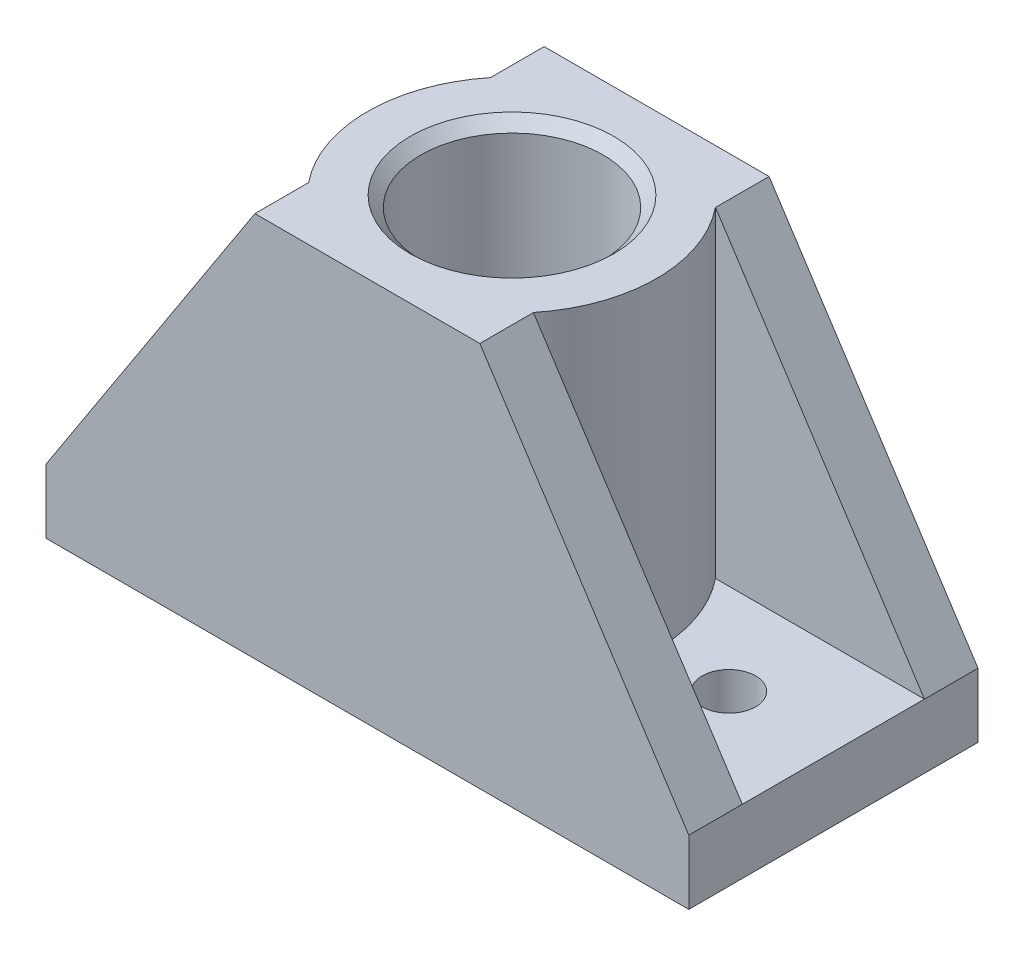
ISO-10303-21;
HEADER;
FILE_DESCRIPTION(('STEP AP214'),'2;1');
FILE_NAME('part.step','',(''),(''),'','','');
FILE_SCHEMA(('AUTOMOTIVE_DESIGN { 1 0 10303 214 1 1 1 1 }'));
ENDSEC;
DATA;
#1=APPLICATION_CONTEXT('core data for automotive mechanical design processes');
#2=APPLICATION_PROTOCOL_DEFINITION('international standard','automotive_design',2000,#1);
#3=PRODUCT_CONTEXT('',#1,'mechanical');
#4=PRODUCT('Part','Part','',(#3));
#5=PRODUCT_RELATED_PRODUCT_CATEGORY('part','',(#4));
#6=PRODUCT_DEFINITION_FORMATION('','',#4);
#7=PRODUCT_DEFINITION_CONTEXT('part definition',#1,'design');
#8=PRODUCT_DEFINITION('design','',#6,#7);
#9=PRODUCT_DEFINITION_SHAPE('','',#8);
#10=(LENGTH_UNIT() NAMED_UNIT(*) SI_UNIT(.MILLI.,.METRE.));
#11=(NAMED_UNIT(*) PLANE_ANGLE_UNIT() SI_UNIT($,.RADIAN.));
#12=(NAMED_UNIT(*) SI_UNIT($,.STERADIAN.) SOLID_ANGLE_UNIT());
#13=UNCERTAINTY_MEASURE_WITH_UNIT(LENGTH_MEASURE(1.E-05),#10,'distance_accuracy_value','');
#14=(GEOMETRIC_REPRESENTATION_CONTEXT(3) GLOBAL_UNCERTAINTY_ASSIGNED_CONTEXT((#13)) GLOBAL_UNIT_ASSIGNED_CONTEXT((#10,
#11,#12)) REPRESENTATION_CONTEXT('',''));
#15=CARTESIAN_POINT('',(0.,0.,0.));
#16=DIRECTION('',(0.,0.,1.));
#17=DIRECTION('',(1.,0.,0.));
#18=AXIS2_PLACEMENT_3D('',#15,#16,#17);
#19=CARTESIAN_POINT('',(0.,6.,0.));
#20=DIRECTION('',(0.,1.,0.));
#21=DIRECTION('',(0.,0.,1.));
#22=AXIS2_PLACEMENT_3D('',#19,#20,#21);
#23=PLANE('',#22);
#24=CARTESIAN_POINT('',(-55.7962783397944,6.,-2.72177419354838));
#25=DIRECTION('',(0.,1.,0.));
#26=DIRECTION('',(0.,0.,1.));
#27=AXIS2_PLACEMENT_3D('',#24,#25,#26);
#28=CIRCLE('',#27,2.5);
#29=CARTESIAN_POINT('',(-55.7962783397944,6.,-0.221774193548373));
#30=VERTEX_POINT('',#29);
#31=EDGE_CURVE('E366',#30,#30,#28,.T.);
#32=ORIENTED_EDGE('',*,*,#31,.F.);
#33=EDGE_LOOP('',(#32));
#34=FACE_BOUND('',#33,.T.);
#35=CARTESIAN_POINT('',(-76.0403225806452,6.,-2.72177419354838));
#36=DIRECTION('',(0.,1.,0.));
#37=DIRECTION('',(0.,0.,1.));
#38=AXIS2_PLACEMENT_3D('',#35,#36,#37);
#39=CIRCLE('',#38,13.5);
#40=CARTESIAN_POINT('',(-65.5522340989436,6.,5.77822580645163));
#41=VERTEX_POINT('',#40);
#42=CARTESIAN_POINT('',(-65.5522340989436,6.,-11.2217741935484));
#43=VERTEX_POINT('',#42);
#44=EDGE_CURVE('E167',#41,#43,#39,.T.);
#45=ORIENTED_EDGE('',*,*,#44,.F.);
#46=DIRECTION('',(-1.,0.,0.));
#47=VECTOR('',#46,1.);
#48=CARTESIAN_POINT('',(-46.0403225806452,6.,5.77822580645162));
#49=LINE('',#48,#47);
#50=CARTESIAN_POINT('',(-46.0403225806452,6.,5.77822580645162));
#51=VERTEX_POINT('',#50);
#52=EDGE_CURVE('E143',#51,#41,#49,.T.);
#53=ORIENTED_EDGE('',*,*,#52,.F.);
#54=DIRECTION('',(0.,0.,-1.));
#55=VECTOR('',#54,1.);
#56=CARTESIAN_POINT('',(-46.0403225806452,6.,-16.2217741935484));
#57=LINE('',#56,#55);
#58=CARTESIAN_POINT('',(-46.0403225806452,6.,-11.2217741935484));
#59=VERTEX_POINT('',#58);
#60=EDGE_CURVE('E154',#51,#59,#57,.T.);
#61=ORIENTED_EDGE('',*,*,#60,.T.);
#62=DIRECTION('',(1.,0.,0.));
#63=VECTOR('',#62,1.);
#64=CARTESIAN_POINT('',(-106.040322580645,6.,-11.2217741935484));
#65=LINE('',#64,#63);
#66=EDGE_CURVE('E300',#43,#59,#65,.T.);
#67=ORIENTED_EDGE('',*,*,#66,.F.);
#68=EDGE_LOOP('',(#45,#53,#61,#67));
#69=FACE_BOUND('',#68,.T.);
#70=ADVANCED_FACE('F36',(#34,#69),#23,.T.);
#71=CARTESIAN_POINT('',(-96.2843668214959,6.,-2.72177419354837));
#72=DIRECTION('',(0.,1.,0.));
#73=DIRECTION('',(0.,0.,1.));
#74=AXIS2_PLACEMENT_3D('',#71,#72,#73);
#75=CIRCLE('',#74,2.50000000000001);
#76=CARTESIAN_POINT('',(-96.2843668214959,6.,-0.221774193548361));
#77=VERTEX_POINT('',#76);
#78=EDGE_CURVE('E196',#77,#77,#75,.T.);
#79=ORIENTED_EDGE('',*,*,#78,.F.);
#80=EDGE_LOOP('',(#79));
#81=FACE_BOUND('',#80,.T.);
#82=DIRECTION('',(0.,0.,1.));
#83=VECTOR('',#82,1.);
#84=CARTESIAN_POINT('',(-106.040322580645,6.,-16.2217741935484));
#85=LINE('',#84,#83);
#86=CARTESIAN_POINT('',(-106.040322580645,6.,-11.2217741935484));
#87=VERTEX_POINT('',#86);
#88=CARTESIAN_POINT('',(-106.040322580645,6.,5.77822580645163));
#89=VERTEX_POINT('',#88);
#90=EDGE_CURVE('E164',#87,#89,#85,.T.);
#91=ORIENTED_EDGE('',*,*,#90,.T.);
#92=CARTESIAN_POINT('',(-86.5284110623466,6.,5.77822580645163));
#93=VERTEX_POINT('',#92);
#94=EDGE_CURVE('E169',#93,#89,#49,.T.);
#95=ORIENTED_EDGE('',*,*,#94,.F.);
#96=CARTESIAN_POINT('',(-86.5284110623467,6.,-11.2217741935484));
#97=VERTEX_POINT('',#96);
#98=EDGE_CURVE('E246',#97,#93,#39,.T.);
#99=ORIENTED_EDGE('',*,*,#98,.F.);
#100=EDGE_CURVE('E307',#87,#97,#65,.T.);
#101=ORIENTED_EDGE('',*,*,#100,.F.);
#102=EDGE_LOOP('',(#91,#95,#99,#101));
#103=FACE_BOUND('',#102,.T.);
#104=ADVANCED_FACE('F215',(#81,#103),#23,.T.);
#105=CARTESIAN_POINT('',(-76.0403225806452,36.,-2.72177419354838));
#106=DIRECTION('',(0.,-1.,0.));
#107=DIRECTION('',(0.,0.,-1.));
#108=AXIS2_PLACEMENT_3D('',#105,#106,#107);
#109=CYLINDRICAL_SURFACE('',#108,13.5);
#110=DIRECTION('',(0.,-1.,0.));
#111=VECTOR('',#110,1.);
#112=CARTESIAN_POINT('',(-86.5284110623466,36.,5.77822580645163));
#113=LINE('',#112,#111);
#114=CARTESIAN_POINT('',(-86.5284110623466,36.,5.77822580645163));
#115=VERTEX_POINT('',#114);
#116=EDGE_CURVE('E293',#115,#93,#113,.T.);
#117=ORIENTED_EDGE('',*,*,#116,.F.);
#118=CARTESIAN_POINT('',(-76.0403225806452,36.,-2.72177419354838));
#119=DIRECTION('',(0.,1.,0.));
#120=DIRECTION('',(0.,0.,1.));
#121=AXIS2_PLACEMENT_3D('',#118,#119,#120);
#122=CIRCLE('',#121,13.5);
#123=CARTESIAN_POINT('',(-86.5284110623467,36.,-11.2217741935484));
#124=VERTEX_POINT('',#123);
#125=EDGE_CURVE('E252',#124,#115,#122,.T.);
#126=ORIENTED_EDGE('',*,*,#125,.F.);
#127=DIRECTION('',(0.,-1.,0.));
#128=VECTOR('',#127,1.);
#129=CARTESIAN_POINT('',(-86.5284110623467,36.,-11.2217741935484));
#130=LINE('',#129,#128);
#131=EDGE_CURVE('E248',#97,#124,#130,.F.);
#132=ORIENTED_EDGE('',*,*,#131,.F.);
#133=ORIENTED_EDGE('',*,*,#98,.T.);
#134=EDGE_LOOP('',(#117,#126,#132,#133));
#135=FACE_BOUND('',#134,.T.);
#136=ADVANCED_FACE('F222',(#135),#109,.T.);
#137=DIRECTION('',(0.,-1.,0.));
#138=VECTOR('',#137,1.);
#139=CARTESIAN_POINT('',(-65.5522340989436,36.,5.77822580645163));
#140=LINE('',#139,#138);
#141=CARTESIAN_POINT('',(-65.5522340989436,36.,5.77822580645163));
#142=VERTEX_POINT('',#141);
#143=EDGE_CURVE('E291',#41,#142,#140,.F.);
#144=ORIENTED_EDGE('',*,*,#143,.F.);
#145=ORIENTED_EDGE('',*,*,#44,.T.);
#146=DIRECTION('',(0.,-1.,0.));
#147=VECTOR('',#146,1.);
#148=CARTESIAN_POINT('',(-65.5522340989436,36.,-11.2217741935484));
#149=LINE('',#148,#147);
#150=CARTESIAN_POINT('',(-65.5522340989436,36.,-11.2217741935484));
#151=VERTEX_POINT('',#150);
#152=EDGE_CURVE('E242',#151,#43,#149,.T.);
#153=ORIENTED_EDGE('',*,*,#152,.F.);
#154=EDGE_CURVE('E244',#142,#151,#122,.T.);
#155=ORIENTED_EDGE('',*,*,#154,.F.);
#156=EDGE_LOOP('',(#144,#145,#153,#155));
#157=FACE_BOUND('',#156,.T.);
#158=ADVANCED_FACE('F344',(#157),#109,.T.);
#159=CARTESIAN_POINT('',(-106.040322580645,6.,-16.2217741935484));
#160=DIRECTION('',(1.,0.,0.));
#161=DIRECTION('',(0.,0.,-1.));
#162=AXIS2_PLACEMENT_3D('',#159,#160,#161);
#163=PLANE('',#162);
#164=DIRECTION('',(0.,-1.,0.));
#165=VECTOR('',#164,1.);
#166=CARTESIAN_POINT('',(-106.040322580645,6.,10.7782258064516));
#167=LINE('',#166,#165);
#168=CARTESIAN_POINT('',(-106.040322580645,5.9999999999998,10.7782258064516));
#169=VERTEX_POINT('',#168);
#170=CARTESIAN_POINT('',(-106.040322580645,0.,10.7782258064516));
#171=VERTEX_POINT('',#170);
#172=EDGE_CURVE('E274',#169,#171,#167,.T.);
#173=ORIENTED_EDGE('',*,*,#172,.F.);
#174=DIRECTION('',(0.,0.,-1.));
#175=VECTOR('',#174,1.);
#176=CARTESIAN_POINT('',(-106.040322580645,5.9999999999998,5.77822580645163));
#177=LINE('',#176,#175);
#178=EDGE_CURVE('E186',#169,#89,#177,.T.);
#179=ORIENTED_EDGE('',*,*,#178,.T.);
#180=ORIENTED_EDGE('',*,*,#90,.F.);
#181=DIRECTION('',(0.,0.,-1.));
#182=VECTOR('',#181,1.);
#183=CARTESIAN_POINT('',(-106.040322580645,5.9999999999998,-16.2217741935484));
#184=LINE('',#183,#182);
#185=CARTESIAN_POINT('',(-106.040322580645,5.9999999999998,-16.2217741935484));
#186=VERTEX_POINT('',#185);
#187=EDGE_CURVE('E51',#87,#186,#184,.T.);
#188=ORIENTED_EDGE('',*,*,#187,.T.);
#189=DIRECTION('',(0.,-1.,0.));
#190=VECTOR('',#189,1.);
#191=CARTESIAN_POINT('',(-106.040322580645,6.,-16.2217741935484));
#192=LINE('',#191,#190);
#193=CARTESIAN_POINT('',(-106.040322580645,0.,-16.2217741935484));
#194=VERTEX_POINT('',#193);
#195=EDGE_CURVE('E163',#186,#194,#192,.T.);
#196=ORIENTED_EDGE('',*,*,#195,.T.);
#197=DIRECTION('',(0.,0.,1.));
#198=VECTOR('',#197,1.);
#199=CARTESIAN_POINT('',(-106.040322580645,0.,-16.2217741935484));
#200=LINE('',#199,#198);
#201=EDGE_CURVE('E254',#194,#171,#200,.T.);
#202=ORIENTED_EDGE('',*,*,#201,.T.);
#203=EDGE_LOOP('',(#173,#179,#180,#188,#196,#202));
#204=FACE_BOUND('',#203,.T.);
#205=ADVANCED_FACE('F325',(#204),#163,.F.);
#206=CARTESIAN_POINT('',(-106.040322580645,6.,10.7782258064516));
#207=DIRECTION('',(0.,0.,-1.));
#208=DIRECTION('',(-1.,0.,0.));
#209=AXIS2_PLACEMENT_3D('',#206,#207,#208);
#210=PLANE('',#209);
#211=DIRECTION('',(0.,-1.,0.));
#212=VECTOR('',#211,1.);
#213=CARTESIAN_POINT('',(-46.0403225806452,6.,10.7782258064516));
#214=LINE('',#213,#212);
#215=CARTESIAN_POINT('',(-46.0403225806452,5.99999999999983,10.7782258064516));
#216=VERTEX_POINT('',#215);
#217=CARTESIAN_POINT('',(-46.0403225806452,0.,10.7782258064516));
#218=VERTEX_POINT('',#217);
#219=EDGE_CURVE('E272',#216,#218,#214,.T.);
#220=ORIENTED_EDGE('',*,*,#219,.F.);
#221=DIRECTION('',(-0.544988350595413,0.838443616300638,0.));
#222=VECTOR('',#221,1.);
#223=CARTESIAN_POINT('',(-65.5403225806452,36.,10.7782258064516));
#224=LINE('',#223,#222);
#225=CARTESIAN_POINT('',(-65.5403225806452,36.,10.7782258064516));
#226=VERTEX_POINT('',#225);
#227=EDGE_CURVE('E173',#216,#226,#224,.T.);
#228=ORIENTED_EDGE('',*,*,#227,.T.);
#229=DIRECTION('',(1.,0.,0.));
#230=VECTOR('',#229,1.);
#231=CARTESIAN_POINT('',(-46.0403225806452,36.,10.7782258064516));
#232=LINE('',#231,#230);
#233=CARTESIAN_POINT('',(-86.5403225806451,36.,10.7782258064516));
#234=VERTEX_POINT('',#233);
#235=EDGE_CURVE('E288',#234,#226,#232,.T.);
#236=ORIENTED_EDGE('',*,*,#235,.F.);
#237=DIRECTION('',(-0.544988350595413,-0.838443616300638,0.));
#238=VECTOR('',#237,1.);
#239=CARTESIAN_POINT('',(-86.5403225806451,36.,10.7782258064516));
#240=LINE('',#239,#238);
#241=EDGE_CURVE('E59',#234,#169,#240,.T.);
#242=ORIENTED_EDGE('',*,*,#241,.T.);
#243=ORIENTED_EDGE('',*,*,#172,.T.);
#244=DIRECTION('',(1.,0.,0.));
#245=VECTOR('',#244,1.);
#246=CARTESIAN_POINT('',(-106.040322580645,0.,10.7782258064516));
#247=LINE('',#246,#245);
#248=EDGE_CURVE('E261',#171,#218,#247,.T.);
#249=ORIENTED_EDGE('',*,*,#248,.T.);
#250=EDGE_LOOP('',(#220,#228,#236,#242,#243,#249));
#251=FACE_BOUND('',#250,.T.);
#252=ADVANCED_FACE('F329',(#251),#210,.F.);
#253=CARTESIAN_POINT('',(-46.0403225806452,6.,-16.2217741935484));
#254=DIRECTION('',(-1.,0.,0.));
#255=DIRECTION('',(0.,0.,1.));
#256=AXIS2_PLACEMENT_3D('',#253,#254,#255);
#257=PLANE('',#256);
#258=ORIENTED_EDGE('',*,*,#60,.F.);
#259=DIRECTION('',(0.,0.,1.));
#260=VECTOR('',#259,1.);
#261=CARTESIAN_POINT('',(-46.0403225806452,5.99999999999983,10.7782258064516));
#262=LINE('',#261,#260);
#263=EDGE_CURVE('E156',#51,#216,#262,.T.);
#264=ORIENTED_EDGE('',*,*,#263,.T.);
#265=ORIENTED_EDGE('',*,*,#219,.T.);
#266=DIRECTION('',(0.,0.,-1.));
#267=VECTOR('',#266,1.);
#268=CARTESIAN_POINT('',(-46.0403225806452,0.,-16.2217741935484));
#269=LINE('',#268,#267);
#270=CARTESIAN_POINT('',(-46.0403225806452,0.,-16.2217741935484));
#271=VERTEX_POINT('',#270);
#272=EDGE_CURVE('E264',#218,#271,#269,.T.);
#273=ORIENTED_EDGE('',*,*,#272,.T.);
#274=DIRECTION('',(0.,-1.,0.));
#275=VECTOR('',#274,1.);
#276=CARTESIAN_POINT('',(-46.0403225806452,6.,-16.2217741935484));
#277=LINE('',#276,#275);
#278=CARTESIAN_POINT('',(-46.0403225806452,5.99999999999983,-16.2217741935484));
#279=VERTEX_POINT('',#278);
#280=EDGE_CURVE('E270',#279,#271,#277,.T.);
#281=ORIENTED_EDGE('',*,*,#280,.F.);
#282=DIRECTION('',(0.,0.,1.));
#283=VECTOR('',#282,1.);
#284=CARTESIAN_POINT('',(-46.0403225806452,5.99999999999983,-11.2217741935484));
#285=LINE('',#284,#283);
#286=EDGE_CURVE('E149',#279,#59,#285,.T.);
#287=ORIENTED_EDGE('',*,*,#286,.T.);
#288=EDGE_LOOP('',(#258,#264,#265,#273,#281,#287));
#289=FACE_BOUND('',#288,.T.);
#290=ADVANCED_FACE('F155',(#289),#257,.F.);
#291=CARTESIAN_POINT('',(-106.040322580645,6.,-16.2217741935484));
#292=DIRECTION('',(0.,0.,1.));
#293=DIRECTION('',(1.,0.,0.));
#294=AXIS2_PLACEMENT_3D('',#291,#292,#293);
#295=PLANE('',#294);
#296=DIRECTION('',(-1.,0.,0.));
#297=VECTOR('',#296,1.);
#298=CARTESIAN_POINT('',(-106.040322580645,36.,-16.2217741935484));
#299=LINE('',#298,#297);
#300=CARTESIAN_POINT('',(-65.5403225806452,36.,-16.2217741935484));
#301=VERTEX_POINT('',#300);
#302=CARTESIAN_POINT('',(-86.5403225806451,36.,-16.2217741935484));
#303=VERTEX_POINT('',#302);
#304=EDGE_CURVE('E303',#301,#303,#299,.T.);
#305=ORIENTED_EDGE('',*,*,#304,.F.);
#306=DIRECTION('',(0.544988350595413,-0.838443616300638,0.));
#307=VECTOR('',#306,1.);
#308=CARTESIAN_POINT('',(-65.5403225806452,36.,-16.2217741935484));
#309=LINE('',#308,#307);
#310=EDGE_CURVE('E181',#301,#279,#309,.T.);
#311=ORIENTED_EDGE('',*,*,#310,.T.);
#312=ORIENTED_EDGE('',*,*,#280,.T.);
#313=DIRECTION('',(-1.,0.,0.));
#314=VECTOR('',#313,1.);
#315=CARTESIAN_POINT('',(-106.040322580645,0.,-16.2217741935484));
#316=LINE('',#315,#314);
#317=EDGE_CURVE('E257',#271,#194,#316,.T.);
#318=ORIENTED_EDGE('',*,*,#317,.T.);
#319=ORIENTED_EDGE('',*,*,#195,.F.);
#320=DIRECTION('',(0.544988350595413,0.838443616300638,0.));
#321=VECTOR('',#320,1.);
#322=CARTESIAN_POINT('',(-86.5403225806451,36.,-16.2217741935484));
#323=LINE('',#322,#321);
#324=EDGE_CURVE('E179',#186,#303,#323,.T.);
#325=ORIENTED_EDGE('',*,*,#324,.T.);
#326=EDGE_LOOP('',(#305,#311,#312,#318,#319,#325));
#327=FACE_BOUND('',#326,.T.);
#328=ADVANCED_FACE('F370',(#327),#295,.F.);
#329=CARTESIAN_POINT('',(0.,0.,0.));
#330=DIRECTION('',(0.,1.,0.));
#331=DIRECTION('',(0.,0.,1.));
#332=AXIS2_PLACEMENT_3D('',#329,#330,#331);
#333=PLANE('',#332);
#334=CARTESIAN_POINT('',(-96.2843668214959,0.,-2.72177419354837));
#335=DIRECTION('',(0.,1.,0.));
#336=DIRECTION('',(0.,0.,1.));
#337=AXIS2_PLACEMENT_3D('',#334,#335,#336);
#338=CIRCLE('',#337,2.50000000000001);
#339=CARTESIAN_POINT('',(-96.2843668214959,0.,-0.221774193548361));
#340=VERTEX_POINT('',#339);
#341=EDGE_CURVE('E195',#340,#340,#338,.T.);
#342=ORIENTED_EDGE('',*,*,#341,.T.);
#343=EDGE_LOOP('',(#342));
#344=FACE_BOUND('',#343,.T.);
#345=CARTESIAN_POINT('',(-55.7962783397944,0.,-2.72177419354838));
#346=DIRECTION('',(0.,1.,0.));
#347=DIRECTION('',(0.,0.,1.));
#348=AXIS2_PLACEMENT_3D('',#345,#346,#347);
#349=CIRCLE('',#348,2.5);
#350=CARTESIAN_POINT('',(-55.7962783397944,0.,-0.221774193548373));
#351=VERTEX_POINT('',#350);
#352=EDGE_CURVE('E192',#351,#351,#349,.T.);
#353=ORIENTED_EDGE('',*,*,#352,.T.);
#354=EDGE_LOOP('',(#353));
#355=FACE_BOUND('',#354,.T.);
#356=ORIENTED_EDGE('',*,*,#201,.F.);
#357=ORIENTED_EDGE('',*,*,#317,.F.);
#358=ORIENTED_EDGE('',*,*,#272,.F.);
#359=ORIENTED_EDGE('',*,*,#248,.F.);
#360=EDGE_LOOP('',(#356,#357,#358,#359));
#361=FACE_BOUND('',#360,.T.);
#362=ADVANCED_FACE('F332',(#344,#355,#361),#333,.F.);
#363=CARTESIAN_POINT('',(-76.0403225806452,36.,-2.72177419354838));
#364=DIRECTION('',(0.,1.,0.));
#365=DIRECTION('',(0.,0.,1.));
#366=AXIS2_PLACEMENT_3D('',#363,#364,#365);
#367=PLANE('',#366);
#368=CARTESIAN_POINT('',(-76.0403225806452,36.,-2.72177419354838));
#369=DIRECTION('',(0.,1.,0.));
#370=DIRECTION('',(0.,0.,1.));
#371=AXIS2_PLACEMENT_3D('',#368,#369,#370);
#372=CIRCLE('',#371,9.49999999999999);
#373=CARTESIAN_POINT('',(-76.0403225806452,36.,6.77822580645161));
#374=VERTEX_POINT('',#373);
#375=EDGE_CURVE('E11',#374,#374,#372,.F.);
#376=ORIENTED_EDGE('',*,*,#375,.T.);
#377=EDGE_LOOP('',(#376));
#378=FACE_BOUND('',#377,.T.);
#379=ORIENTED_EDGE('',*,*,#235,.T.);
#380=DIRECTION('',(0.,0.,-1.));
#381=VECTOR('',#380,1.);
#382=CARTESIAN_POINT('',(-65.5403225806452,36.,5.77822580645162));
#383=LINE('',#382,#381);
#384=CARTESIAN_POINT('',(-65.5403225806452,36.,5.77822580645163));
#385=VERTEX_POINT('',#384);
#386=EDGE_CURVE('E150',#226,#385,#383,.T.);
#387=ORIENTED_EDGE('',*,*,#386,.T.);
#388=DIRECTION('',(-1.,0.,0.));
#389=VECTOR('',#388,1.);
#390=CARTESIAN_POINT('',(-46.0403225806452,36.,5.77822580645162));
#391=LINE('',#390,#389);
#392=EDGE_CURVE('E144',#385,#142,#391,.T.);
#393=ORIENTED_EDGE('',*,*,#392,.T.);
#394=ORIENTED_EDGE('',*,*,#154,.T.);
#395=DIRECTION('',(1.,0.,0.));
#396=VECTOR('',#395,1.);
#397=CARTESIAN_POINT('',(-106.040322580645,36.,-11.2217741935484));
#398=LINE('',#397,#396);
#399=CARTESIAN_POINT('',(-65.5403225806452,36.,-11.2217741935484));
#400=VERTEX_POINT('',#399);
#401=EDGE_CURVE('E304',#151,#400,#398,.T.);
#402=ORIENTED_EDGE('',*,*,#401,.T.);
#403=DIRECTION('',(0.,0.,-1.));
#404=VECTOR('',#403,1.);
#405=CARTESIAN_POINT('',(-65.5403225806452,36.,-16.2217741935484));
#406=LINE('',#405,#404);
#407=EDGE_CURVE('E282',#400,#301,#406,.T.);
#408=ORIENTED_EDGE('',*,*,#407,.T.);
#409=ORIENTED_EDGE('',*,*,#304,.T.);
#410=DIRECTION('',(0.,0.,1.));
#411=VECTOR('',#410,1.);
#412=CARTESIAN_POINT('',(-86.5403225806451,36.,-11.2217741935484));
#413=LINE('',#412,#411);
#414=CARTESIAN_POINT('',(-86.5403225806451,36.,-11.2217741935484));
#415=VERTEX_POINT('',#414);
#416=EDGE_CURVE('E276',#303,#415,#413,.T.);
#417=ORIENTED_EDGE('',*,*,#416,.T.);
#418=EDGE_CURVE('E301',#415,#124,#398,.T.);
#419=ORIENTED_EDGE('',*,*,#418,.T.);
#420=ORIENTED_EDGE('',*,*,#125,.T.);
#421=CARTESIAN_POINT('',(-86.5403225806451,36.,5.77822580645163));
#422=VERTEX_POINT('',#421);
#423=EDGE_CURVE('E168',#115,#422,#391,.T.);
#424=ORIENTED_EDGE('',*,*,#423,.T.);
#425=DIRECTION('',(0.,0.,1.));
#426=VECTOR('',#425,1.);
#427=CARTESIAN_POINT('',(-86.5403225806451,36.,10.7782258064516));
#428=LINE('',#427,#426);
#429=EDGE_CURVE('E279',#422,#234,#428,.T.);
#430=ORIENTED_EDGE('',*,*,#429,.T.);
#431=EDGE_LOOP('',(#379,#387,#393,#394,#402,#408,#409,#417,#419,#420,#424,#430));
#432=FACE_BOUND('',#431,.T.);
#433=ADVANCED_FACE('F237',(#378,#432),#367,.T.);
#434=CARTESIAN_POINT('',(-76.0403225806452,36.,-2.72177419354838));
#435=DIRECTION('',(0.,-1.,0.));
#436=DIRECTION('',(0.,0.,-1.));
#437=AXIS2_PLACEMENT_3D('',#434,#435,#436);
#438=CYLINDRICAL_SURFACE('',#437,8.5);
#439=CARTESIAN_POINT('',(-76.0403225806452,35.,-2.72177419354838));
#440=DIRECTION('',(0.,1.,0.));
#441=DIRECTION('',(0.,0.,1.));
#442=AXIS2_PLACEMENT_3D('',#439,#440,#441);
#443=CIRCLE('',#442,8.5);
#444=CARTESIAN_POINT('',(-76.0403225806452,35.,5.77822580645162));
#445=VERTEX_POINT('',#444);
#446=EDGE_CURVE('E44',#445,#445,#443,.T.);
#447=ORIENTED_EDGE('',*,*,#446,.T.);
#448=EDGE_LOOP('',(#447));
#449=FACE_BOUND('',#448,.T.);
#450=CARTESIAN_POINT('',(-76.0403225806452,6.,-2.72177419354838));
#451=DIRECTION('',(0.,1.,0.));
#452=DIRECTION('',(0.,0.,1.));
#453=AXIS2_PLACEMENT_3D('',#450,#451,#452);
#454=CIRCLE('',#453,8.5);
#455=CARTESIAN_POINT('',(-76.0403225806452,6.,5.77822580645162));
#456=VERTEX_POINT('',#455);
#457=EDGE_CURVE('E241',#456,#456,#454,.T.);
#458=ORIENTED_EDGE('',*,*,#457,.F.);
#459=EDGE_LOOP('',(#458));
#460=FACE_BOUND('',#459,.T.);
#461=ADVANCED_FACE('F201',(#449,#460),#438,.F.);
#462=ORIENTED_EDGE('',*,*,#457,.T.);
#463=EDGE_LOOP('',(#462));
#464=FACE_BOUND('',#463,.T.);
#465=ADVANCED_FACE('F218',(#464),#23,.T.);
#466=CARTESIAN_POINT('',(-106.040322580645,36.,-11.2217741935484));
#467=DIRECTION('',(0.,0.,-1.));
#468=DIRECTION('',(-1.,0.,0.));
#469=AXIS2_PLACEMENT_3D('',#466,#467,#468);
#470=PLANE('',#469);
#471=ORIENTED_EDGE('',*,*,#66,.T.);
#472=DIRECTION('',(-0.544988350595413,0.838443616300638,0.));
#473=VECTOR('',#472,1.);
#474=CARTESIAN_POINT('',(-65.5403225806452,36.,-11.2217741935484));
#475=LINE('',#474,#473);
#476=EDGE_CURVE('E183',#59,#400,#475,.T.);
#477=ORIENTED_EDGE('',*,*,#476,.T.);
#478=ORIENTED_EDGE('',*,*,#401,.F.);
#479=ORIENTED_EDGE('',*,*,#152,.T.);
#480=EDGE_LOOP('',(#471,#477,#478,#479));
#481=FACE_BOUND('',#480,.T.);
#482=ADVANCED_FACE('F228',(#481),#470,.F.);
#483=ORIENTED_EDGE('',*,*,#418,.F.);
#484=DIRECTION('',(-0.544988350595413,-0.838443616300638,0.));
#485=VECTOR('',#484,1.);
#486=CARTESIAN_POINT('',(-86.5403225806451,36.,-11.2217741935484));
#487=LINE('',#486,#485);
#488=EDGE_CURVE('E190',#415,#87,#487,.T.);
#489=ORIENTED_EDGE('',*,*,#488,.T.);
#490=ORIENTED_EDGE('',*,*,#100,.T.);
#491=ORIENTED_EDGE('',*,*,#131,.T.);
#492=EDGE_LOOP('',(#483,#489,#490,#491));
#493=FACE_BOUND('',#492,.T.);
#494=ADVANCED_FACE('F234',(#493),#470,.F.);
#495=CARTESIAN_POINT('',(-46.0403225806452,36.,5.77822580645162));
#496=DIRECTION('',(0.,0.,1.));
#497=DIRECTION('',(1.,0.,0.));
#498=AXIS2_PLACEMENT_3D('',#495,#496,#497);
#499=PLANE('',#498);
#500=ORIENTED_EDGE('',*,*,#94,.T.);
#501=DIRECTION('',(0.544988350595413,0.838443616300638,0.));
#502=VECTOR('',#501,1.);
#503=CARTESIAN_POINT('',(-86.5403225806451,36.,5.77822580645163));
#504=LINE('',#503,#502);
#505=EDGE_CURVE('E188',#89,#422,#504,.T.);
#506=ORIENTED_EDGE('',*,*,#505,.T.);
#507=ORIENTED_EDGE('',*,*,#423,.F.);
#508=ORIENTED_EDGE('',*,*,#116,.T.);
#509=EDGE_LOOP('',(#500,#506,#507,#508));
#510=FACE_BOUND('',#509,.T.);
#511=ADVANCED_FACE('F320',(#510),#499,.F.);
#512=ORIENTED_EDGE('',*,*,#392,.F.);
#513=DIRECTION('',(0.544988350595413,-0.838443616300638,0.));
#514=VECTOR('',#513,1.);
#515=CARTESIAN_POINT('',(-65.5403225806452,36.,5.77822580645163));
#516=LINE('',#515,#514);
#517=EDGE_CURVE('E138',#385,#51,#516,.T.);
#518=ORIENTED_EDGE('',*,*,#517,.T.);
#519=ORIENTED_EDGE('',*,*,#52,.T.);
#520=ORIENTED_EDGE('',*,*,#143,.T.);
#521=EDGE_LOOP('',(#512,#518,#519,#520));
#522=FACE_BOUND('',#521,.T.);
#523=ADVANCED_FACE('F140',(#522),#499,.F.);
#524=CARTESIAN_POINT('',(-65.5403225806452,36.,-2.72177419354838));
#525=DIRECTION('',(0.838443616300638,0.544988350595413,0.));
#526=DIRECTION('',(0.,0.,1.));
#527=AXIS2_PLACEMENT_3D('',#524,#525,#526);
#528=PLANE('',#527);
#529=ORIENTED_EDGE('',*,*,#227,.F.);
#530=ORIENTED_EDGE('',*,*,#263,.F.);
#531=ORIENTED_EDGE('',*,*,#517,.F.);
#532=ORIENTED_EDGE('',*,*,#386,.F.);
#533=EDGE_LOOP('',(#529,#530,#531,#532));
#534=FACE_BOUND('',#533,.T.);
#535=ADVANCED_FACE('F172',(#534),#528,.T.);
#536=CARTESIAN_POINT('',(-65.5403225806452,36.,-2.72177419354838));
#537=DIRECTION('',(0.838443616300638,0.544988350595413,0.));
#538=DIRECTION('',(0.,0.,1.));
#539=AXIS2_PLACEMENT_3D('',#536,#537,#538);
#540=PLANE('',#539);
#541=ORIENTED_EDGE('',*,*,#476,.F.);
#542=ORIENTED_EDGE('',*,*,#286,.F.);
#543=ORIENTED_EDGE('',*,*,#310,.F.);
#544=ORIENTED_EDGE('',*,*,#407,.F.);
#545=EDGE_LOOP('',(#541,#542,#543,#544));
#546=FACE_BOUND('',#545,.T.);
#547=ADVANCED_FACE('F337',(#546),#540,.T.);
#548=CARTESIAN_POINT('',(-86.5403225806451,36.,-2.72177419354838));
#549=DIRECTION('',(-0.838443616300638,0.544988350595413,0.));
#550=DIRECTION('',(0.,0.,-1.));
#551=AXIS2_PLACEMENT_3D('',#548,#549,#550);
#552=PLANE('',#551);
#553=ORIENTED_EDGE('',*,*,#505,.F.);
#554=ORIENTED_EDGE('',*,*,#178,.F.);
#555=ORIENTED_EDGE('',*,*,#241,.F.);
#556=ORIENTED_EDGE('',*,*,#429,.F.);
#557=EDGE_LOOP('',(#553,#554,#555,#556));
#558=FACE_BOUND('',#557,.T.);
#559=ADVANCED_FACE('F324',(#558),#552,.T.);
#560=CARTESIAN_POINT('',(-86.5403225806451,36.,-2.72177419354838));
#561=DIRECTION('',(-0.838443616300638,0.544988350595413,0.));
#562=DIRECTION('',(0.,0.,-1.));
#563=AXIS2_PLACEMENT_3D('',#560,#561,#562);
#564=PLANE('',#563);
#565=ORIENTED_EDGE('',*,*,#324,.F.);
#566=ORIENTED_EDGE('',*,*,#187,.F.);
#567=ORIENTED_EDGE('',*,*,#488,.F.);
#568=ORIENTED_EDGE('',*,*,#416,.F.);
#569=EDGE_LOOP('',(#565,#566,#567,#568));
#570=FACE_BOUND('',#569,.T.);
#571=ADVANCED_FACE('F358',(#570),#564,.T.);
#572=CARTESIAN_POINT('',(-55.7962783397944,-24.,-2.72177419354838));
#573=DIRECTION('',(0.,1.,0.));
#574=DIRECTION('',(0.,0.,1.));
#575=AXIS2_PLACEMENT_3D('',#572,#573,#574);
#576=CYLINDRICAL_SURFACE('',#575,2.5);
#577=ORIENTED_EDGE('',*,*,#31,.T.);
#578=EDGE_LOOP('',(#577));
#579=FACE_BOUND('',#578,.T.);
#580=ORIENTED_EDGE('',*,*,#352,.F.);
#581=EDGE_LOOP('',(#580));
#582=FACE_BOUND('',#581,.T.);
#583=ADVANCED_FACE('F210',(#579,#582),#576,.F.);
#584=CARTESIAN_POINT('',(-96.2843668214959,-24.,-2.72177419354837));
#585=DIRECTION('',(0.,1.,0.));
#586=DIRECTION('',(0.,0.,1.));
#587=AXIS2_PLACEMENT_3D('',#584,#585,#586);
#588=CYLINDRICAL_SURFACE('',#587,2.50000000000001);
#589=ORIENTED_EDGE('',*,*,#78,.T.);
#590=EDGE_LOOP('',(#589));
#591=FACE_BOUND('',#590,.T.);
#592=ORIENTED_EDGE('',*,*,#341,.F.);
#593=EDGE_LOOP('',(#592));
#594=FACE_BOUND('',#593,.T.);
#595=ADVANCED_FACE('F205',(#591,#594),#588,.F.);
#596=CARTESIAN_POINT('',(-76.0403225806452,35.,-2.72177419354838));
#597=DIRECTION('',(0.,1.,0.));
#598=DIRECTION('',(0.,0.,1.));
#599=AXIS2_PLACEMENT_3D('',#596,#597,#598);
#600=CONICAL_SURFACE('',#599,8.5,0.785398163397453);
#601=ORIENTED_EDGE('',*,*,#375,.F.);
#602=EDGE_LOOP('',(#601));
#603=FACE_BOUND('',#602,.T.);
#604=ORIENTED_EDGE('',*,*,#446,.F.);
#605=EDGE_LOOP('',(#604));
#606=FACE_BOUND('',#605,.T.);
#607=ADVANCED_FACE('F38',(#603,#606),#600,.F.);
#608=CLOSED_SHELL('',(#70,#104,#136,#158,#205,#252,#290,#328,#362,#433,#461,#465,#482,#494,#511,
#523,#535,#547,#559,#571,#583,#595,#607));
#609=MANIFOLD_SOLID_BREP('B2',#608);
#610=ADVANCED_BREP_SHAPE_REPRESENTATION('',(#18,#609),#14);
#611=SHAPE_DEFINITION_REPRESENTATION(#9,#610);
ENDSEC;
END-ISO-10303-21;
